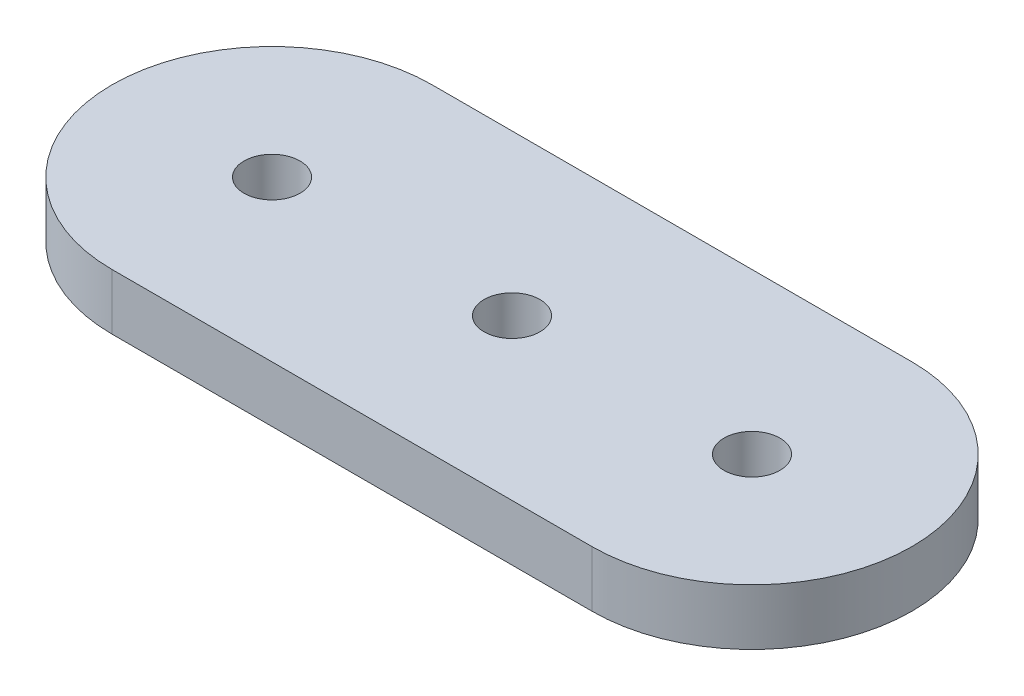
ISO-10303-21;
HEADER;
FILE_DESCRIPTION(('STEP AP214'),'2;1');
FILE_NAME('part.step','',(''),(''),'','','');
FILE_SCHEMA(('AUTOMOTIVE_DESIGN { 1 0 10303 214 1 1 1 1 }'));
ENDSEC;
DATA;
#1=APPLICATION_CONTEXT('core data for automotive mechanical design processes');
#2=APPLICATION_PROTOCOL_DEFINITION('international standard','automotive_design',2000,#1);
#3=PRODUCT_CONTEXT('',#1,'mechanical');
#4=PRODUCT('Part','Part','',(#3));
#5=PRODUCT_RELATED_PRODUCT_CATEGORY('part','',(#4));
#6=PRODUCT_DEFINITION_FORMATION('','',#4);
#7=PRODUCT_DEFINITION_CONTEXT('part definition',#1,'design');
#8=PRODUCT_DEFINITION('design','',#6,#7);
#9=PRODUCT_DEFINITION_SHAPE('','',#8);
#10=(LENGTH_UNIT() NAMED_UNIT(*) SI_UNIT(.MILLI.,.METRE.));
#11=(NAMED_UNIT(*) PLANE_ANGLE_UNIT() SI_UNIT($,.RADIAN.));
#12=(NAMED_UNIT(*) SI_UNIT($,.STERADIAN.) SOLID_ANGLE_UNIT());
#13=UNCERTAINTY_MEASURE_WITH_UNIT(LENGTH_MEASURE(1.E-05),#10,'distance_accuracy_value','');
#14=(GEOMETRIC_REPRESENTATION_CONTEXT(3) GLOBAL_UNCERTAINTY_ASSIGNED_CONTEXT((#13)) GLOBAL_UNIT_ASSIGNED_CONTEXT((#10,
#11,#12)) REPRESENTATION_CONTEXT('',''));
#15=CARTESIAN_POINT('',(0.,0.,0.));
#16=DIRECTION('',(0.,0.,1.));
#17=DIRECTION('',(1.,0.,0.));
#18=AXIS2_PLACEMENT_3D('',#15,#16,#17);
#19=CARTESIAN_POINT('',(0.,3.5,0.));
#20=DIRECTION('',(0.,1.,0.));
#21=DIRECTION('',(0.,0.,1.));
#22=AXIS2_PLACEMENT_3D('',#19,#20,#21);
#23=PLANE('',#22);
#24=CARTESIAN_POINT('',(30.,3.5,0.));
#25=DIRECTION('',(0.,1.,0.));
#26=DIRECTION('',(0.,0.,1.));
#27=AXIS2_PLACEMENT_3D('',#24,#25,#26);
#28=CIRCLE('',#27,1.75);
#29=CARTESIAN_POINT('',(30.,3.5,1.75));
#30=VERTEX_POINT('',#29);
#31=EDGE_CURVE('E116',#30,#30,#28,.T.);
#32=ORIENTED_EDGE('',*,*,#31,.F.);
#33=EDGE_LOOP('',(#32));
#34=FACE_BOUND('',#33,.T.);
#35=CARTESIAN_POINT('',(0.,3.5,0.));
#36=DIRECTION('',(0.,1.,0.));
#37=DIRECTION('',(0.,0.,1.));
#38=AXIS2_PLACEMENT_3D('',#35,#36,#37);
#39=CIRCLE('',#38,10.);
#40=CARTESIAN_POINT('',(0.,3.5,-10.));
#41=VERTEX_POINT('',#40);
#42=CARTESIAN_POINT('',(0.,3.5,10.));
#43=VERTEX_POINT('',#42);
#44=EDGE_CURVE('E86',#41,#43,#39,.T.);
#45=ORIENTED_EDGE('',*,*,#44,.T.);
#46=DIRECTION('',(1.,0.,0.));
#47=VECTOR('',#46,1.);
#48=CARTESIAN_POINT('',(0.,3.5,10.));
#49=LINE('',#48,#47);
#50=CARTESIAN_POINT('',(30.,3.5,10.));
#51=VERTEX_POINT('',#50);
#52=EDGE_CURVE('E81',#43,#51,#49,.T.);
#53=ORIENTED_EDGE('',*,*,#52,.T.);
#54=CARTESIAN_POINT('',(30.,3.5,0.));
#55=DIRECTION('',(0.,1.,0.));
#56=DIRECTION('',(0.,0.,1.));
#57=AXIS2_PLACEMENT_3D('',#54,#55,#56);
#58=CIRCLE('',#57,10.);
#59=CARTESIAN_POINT('',(30.,3.5,-10.));
#60=VERTEX_POINT('',#59);
#61=EDGE_CURVE('E84',#51,#60,#58,.T.);
#62=ORIENTED_EDGE('',*,*,#61,.T.);
#63=DIRECTION('',(-1.,0.,0.));
#64=VECTOR('',#63,1.);
#65=CARTESIAN_POINT('',(0.,3.5,-10.));
#66=LINE('',#65,#64);
#67=EDGE_CURVE('E51',#60,#41,#66,.T.);
#68=ORIENTED_EDGE('',*,*,#67,.T.);
#69=EDGE_LOOP('',(#45,#53,#62,#68));
#70=FACE_BOUND('',#69,.T.);
#71=CARTESIAN_POINT('',(0.,3.5,0.));
#72=DIRECTION('',(0.,1.,0.));
#73=DIRECTION('',(0.,0.,1.));
#74=AXIS2_PLACEMENT_3D('',#71,#72,#73);
#75=CIRCLE('',#74,1.75);
#76=CARTESIAN_POINT('',(0.,3.5,1.75));
#77=VERTEX_POINT('',#76);
#78=EDGE_CURVE('E101',#77,#77,#75,.T.);
#79=ORIENTED_EDGE('',*,*,#78,.F.);
#80=EDGE_LOOP('',(#79));
#81=FACE_BOUND('',#80,.T.);
#82=CARTESIAN_POINT('',(15.,3.5,0.));
#83=DIRECTION('',(0.,1.,0.));
#84=DIRECTION('',(0.,0.,1.));
#85=AXIS2_PLACEMENT_3D('',#82,#83,#84);
#86=CIRCLE('',#85,1.75);
#87=CARTESIAN_POINT('',(15.,3.5,1.75));
#88=VERTEX_POINT('',#87);
#89=EDGE_CURVE('E122',#88,#88,#86,.T.);
#90=ORIENTED_EDGE('',*,*,#89,.F.);
#91=EDGE_LOOP('',(#90));
#92=FACE_BOUND('',#91,.T.);
#93=ADVANCED_FACE('F34',(#34,#70,#81,#92),#23,.T.);
#94=CARTESIAN_POINT('',(0.,0.,0.));
#95=DIRECTION('',(0.,1.,0.));
#96=DIRECTION('',(0.,0.,1.));
#97=AXIS2_PLACEMENT_3D('',#94,#95,#96);
#98=PLANE('',#97);
#99=CARTESIAN_POINT('',(0.,0.,0.));
#100=DIRECTION('',(0.,1.,0.));
#101=DIRECTION('',(0.,0.,1.));
#102=AXIS2_PLACEMENT_3D('',#99,#100,#101);
#103=CIRCLE('',#102,10.);
#104=CARTESIAN_POINT('',(0.,0.,-10.));
#105=VERTEX_POINT('',#104);
#106=CARTESIAN_POINT('',(0.,0.,10.));
#107=VERTEX_POINT('',#106);
#108=EDGE_CURVE('E98',#105,#107,#103,.T.);
#109=ORIENTED_EDGE('',*,*,#108,.F.);
#110=DIRECTION('',(-1.,0.,0.));
#111=VECTOR('',#110,1.);
#112=CARTESIAN_POINT('',(0.,0.,-10.));
#113=LINE('',#112,#111);
#114=CARTESIAN_POINT('',(30.,0.,-10.));
#115=VERTEX_POINT('',#114);
#116=EDGE_CURVE('E74',#115,#105,#113,.T.);
#117=ORIENTED_EDGE('',*,*,#116,.F.);
#118=CARTESIAN_POINT('',(30.,0.,0.));
#119=DIRECTION('',(0.,1.,0.));
#120=DIRECTION('',(0.,0.,1.));
#121=AXIS2_PLACEMENT_3D('',#118,#119,#120);
#122=CIRCLE('',#121,10.);
#123=CARTESIAN_POINT('',(30.,0.,10.));
#124=VERTEX_POINT('',#123);
#125=EDGE_CURVE('E68',#124,#115,#122,.T.);
#126=ORIENTED_EDGE('',*,*,#125,.F.);
#127=DIRECTION('',(1.,0.,0.));
#128=VECTOR('',#127,1.);
#129=CARTESIAN_POINT('',(0.,0.,10.));
#130=LINE('',#129,#128);
#131=EDGE_CURVE('E90',#107,#124,#130,.T.);
#132=ORIENTED_EDGE('',*,*,#131,.F.);
#133=EDGE_LOOP('',(#109,#117,#126,#132));
#134=FACE_BOUND('',#133,.T.);
#135=CARTESIAN_POINT('',(0.,0.,0.));
#136=DIRECTION('',(0.,1.,0.));
#137=DIRECTION('',(0.,0.,1.));
#138=AXIS2_PLACEMENT_3D('',#135,#136,#137);
#139=CIRCLE('',#138,1.75);
#140=CARTESIAN_POINT('',(0.,0.,1.75));
#141=VERTEX_POINT('',#140);
#142=EDGE_CURVE('E113',#141,#141,#139,.T.);
#143=ORIENTED_EDGE('',*,*,#142,.T.);
#144=EDGE_LOOP('',(#143));
#145=FACE_BOUND('',#144,.T.);
#146=CARTESIAN_POINT('',(30.,0.,0.));
#147=DIRECTION('',(0.,1.,0.));
#148=DIRECTION('',(0.,0.,1.));
#149=AXIS2_PLACEMENT_3D('',#146,#147,#148);
#150=CIRCLE('',#149,1.75);
#151=CARTESIAN_POINT('',(30.,0.,1.75));
#152=VERTEX_POINT('',#151);
#153=EDGE_CURVE('E119',#152,#152,#150,.T.);
#154=ORIENTED_EDGE('',*,*,#153,.T.);
#155=EDGE_LOOP('',(#154));
#156=FACE_BOUND('',#155,.T.);
#157=CARTESIAN_POINT('',(15.,0.,0.));
#158=DIRECTION('',(0.,1.,0.));
#159=DIRECTION('',(0.,0.,1.));
#160=AXIS2_PLACEMENT_3D('',#157,#158,#159);
#161=CIRCLE('',#160,1.75);
#162=CARTESIAN_POINT('',(15.,0.,1.75));
#163=VERTEX_POINT('',#162);
#164=EDGE_CURVE('E125',#163,#163,#161,.T.);
#165=ORIENTED_EDGE('',*,*,#164,.T.);
#166=EDGE_LOOP('',(#165));
#167=FACE_BOUND('',#166,.T.);
#168=ADVANCED_FACE('F109',(#134,#145,#156,#167),#98,.F.);
#169=CARTESIAN_POINT('',(0.,3.5,0.));
#170=DIRECTION('',(0.,-1.,0.));
#171=DIRECTION('',(0.,0.,-1.));
#172=AXIS2_PLACEMENT_3D('',#169,#170,#171);
#173=CYLINDRICAL_SURFACE('',#172,10.);
#174=ORIENTED_EDGE('',*,*,#108,.T.);
#175=DIRECTION('',(0.,-1.,0.));
#176=VECTOR('',#175,1.);
#177=CARTESIAN_POINT('',(0.,3.5,10.));
#178=LINE('',#177,#176);
#179=EDGE_CURVE('E11',#43,#107,#178,.T.);
#180=ORIENTED_EDGE('',*,*,#179,.F.);
#181=ORIENTED_EDGE('',*,*,#44,.F.);
#182=DIRECTION('',(0.,-1.,0.));
#183=VECTOR('',#182,1.);
#184=CARTESIAN_POINT('',(0.,3.5,-10.));
#185=LINE('',#184,#183);
#186=EDGE_CURVE('E94',#41,#105,#185,.T.);
#187=ORIENTED_EDGE('',*,*,#186,.T.);
#188=EDGE_LOOP('',(#174,#180,#181,#187));
#189=FACE_BOUND('',#188,.T.);
#190=ADVANCED_FACE('F36',(#189),#173,.T.);
#191=CARTESIAN_POINT('',(0.,3.5,10.));
#192=DIRECTION('',(0.,0.,-1.));
#193=DIRECTION('',(-1.,0.,0.));
#194=AXIS2_PLACEMENT_3D('',#191,#192,#193);
#195=PLANE('',#194);
#196=ORIENTED_EDGE('',*,*,#131,.T.);
#197=DIRECTION('',(0.,-1.,0.));
#198=VECTOR('',#197,1.);
#199=CARTESIAN_POINT('',(30.,3.5,10.));
#200=LINE('',#199,#198);
#201=EDGE_CURVE('E43',#51,#124,#200,.T.);
#202=ORIENTED_EDGE('',*,*,#201,.F.);
#203=ORIENTED_EDGE('',*,*,#52,.F.);
#204=ORIENTED_EDGE('',*,*,#179,.T.);
#205=EDGE_LOOP('',(#196,#202,#203,#204));
#206=FACE_BOUND('',#205,.T.);
#207=ADVANCED_FACE('F89',(#206),#195,.F.);
#208=CARTESIAN_POINT('',(30.,3.5,0.));
#209=DIRECTION('',(0.,-1.,0.));
#210=DIRECTION('',(0.,0.,-1.));
#211=AXIS2_PLACEMENT_3D('',#208,#209,#210);
#212=CYLINDRICAL_SURFACE('',#211,10.);
#213=ORIENTED_EDGE('',*,*,#125,.T.);
#214=DIRECTION('',(0.,-1.,0.));
#215=VECTOR('',#214,1.);
#216=CARTESIAN_POINT('',(30.,3.5,-10.));
#217=LINE('',#216,#215);
#218=EDGE_CURVE('E91',#60,#115,#217,.T.);
#219=ORIENTED_EDGE('',*,*,#218,.F.);
#220=ORIENTED_EDGE('',*,*,#61,.F.);
#221=ORIENTED_EDGE('',*,*,#201,.T.);
#222=EDGE_LOOP('',(#213,#219,#220,#221));
#223=FACE_BOUND('',#222,.T.);
#224=ADVANCED_FACE('F92',(#223),#212,.T.);
#225=CARTESIAN_POINT('',(0.,3.5,-10.));
#226=DIRECTION('',(0.,0.,1.));
#227=DIRECTION('',(1.,0.,0.));
#228=AXIS2_PLACEMENT_3D('',#225,#226,#227);
#229=PLANE('',#228);
#230=ORIENTED_EDGE('',*,*,#116,.T.);
#231=ORIENTED_EDGE('',*,*,#186,.F.);
#232=ORIENTED_EDGE('',*,*,#67,.F.);
#233=ORIENTED_EDGE('',*,*,#218,.T.);
#234=EDGE_LOOP('',(#230,#231,#232,#233));
#235=FACE_BOUND('',#234,.T.);
#236=ADVANCED_FACE('F106',(#235),#229,.F.);
#237=CARTESIAN_POINT('',(0.,3.5,0.));
#238=DIRECTION('',(0.,-1.,0.));
#239=DIRECTION('',(0.,0.,-1.));
#240=AXIS2_PLACEMENT_3D('',#237,#238,#239);
#241=CYLINDRICAL_SURFACE('',#240,1.75);
#242=ORIENTED_EDGE('',*,*,#78,.T.);
#243=EDGE_LOOP('',(#242));
#244=FACE_BOUND('',#243,.T.);
#245=ORIENTED_EDGE('',*,*,#142,.F.);
#246=EDGE_LOOP('',(#245));
#247=FACE_BOUND('',#246,.T.);
#248=ADVANCED_FACE('F143',(#244,#247),#241,.F.);
#249=CARTESIAN_POINT('',(30.,3.5,0.));
#250=DIRECTION('',(0.,-1.,0.));
#251=DIRECTION('',(0.,0.,-1.));
#252=AXIS2_PLACEMENT_3D('',#249,#250,#251);
#253=CYLINDRICAL_SURFACE('',#252,1.75);
#254=ORIENTED_EDGE('',*,*,#31,.T.);
#255=EDGE_LOOP('',(#254));
#256=FACE_BOUND('',#255,.T.);
#257=ORIENTED_EDGE('',*,*,#153,.F.);
#258=EDGE_LOOP('',(#257));
#259=FACE_BOUND('',#258,.T.);
#260=ADVANCED_FACE('F189',(#256,#259),#253,.F.);
#261=CARTESIAN_POINT('',(15.,3.5,0.));
#262=DIRECTION('',(0.,-1.,0.));
#263=DIRECTION('',(0.,0.,-1.));
#264=AXIS2_PLACEMENT_3D('',#261,#262,#263);
#265=CYLINDRICAL_SURFACE('',#264,1.75);
#266=ORIENTED_EDGE('',*,*,#89,.T.);
#267=EDGE_LOOP('',(#266));
#268=FACE_BOUND('',#267,.T.);
#269=ORIENTED_EDGE('',*,*,#164,.F.);
#270=EDGE_LOOP('',(#269));
#271=FACE_BOUND('',#270,.T.);
#272=ADVANCED_FACE('F131',(#268,#271),#265,.F.);
#273=CLOSED_SHELL('',(#93,#168,#190,#207,#224,#236,#248,#260,#272));
#274=MANIFOLD_SOLID_BREP('B2',#273);
#275=ADVANCED_BREP_SHAPE_REPRESENTATION('',(#18,#274),#14);
#276=SHAPE_DEFINITION_REPRESENTATION(#9,#275);
ENDSEC;
END-ISO-10303-21;
